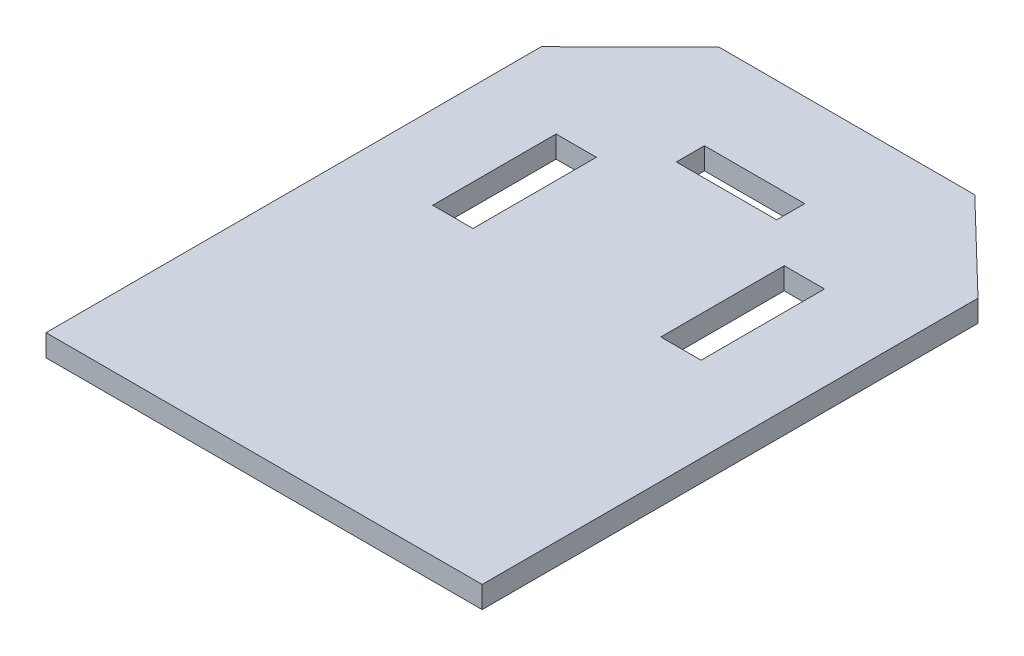
ISO-10303-21;
HEADER;
FILE_DESCRIPTION(('STEP AP214'),'2;1');
FILE_NAME('part.step','',(''),(''),'','','');
FILE_SCHEMA(('AUTOMOTIVE_DESIGN { 1 0 10303 214 1 1 1 1 }'));
ENDSEC;
DATA;
#1=APPLICATION_CONTEXT('core data for automotive mechanical design processes');
#2=APPLICATION_PROTOCOL_DEFINITION('international standard','automotive_design',2000,#1);
#3=PRODUCT_CONTEXT('',#1,'mechanical');
#4=PRODUCT('Part','Part','',(#3));
#5=PRODUCT_RELATED_PRODUCT_CATEGORY('part','',(#4));
#6=PRODUCT_DEFINITION_FORMATION('','',#4);
#7=PRODUCT_DEFINITION_CONTEXT('part definition',#1,'design');
#8=PRODUCT_DEFINITION('design','',#6,#7);
#9=PRODUCT_DEFINITION_SHAPE('','',#8);
#10=(LENGTH_UNIT() NAMED_UNIT(*) SI_UNIT(.MILLI.,.METRE.));
#11=(NAMED_UNIT(*) PLANE_ANGLE_UNIT() SI_UNIT($,.RADIAN.));
#12=(NAMED_UNIT(*) SI_UNIT($,.STERADIAN.) SOLID_ANGLE_UNIT());
#13=UNCERTAINTY_MEASURE_WITH_UNIT(LENGTH_MEASURE(1.E-05),#10,'distance_accuracy_value','');
#14=(GEOMETRIC_REPRESENTATION_CONTEXT(3) GLOBAL_UNCERTAINTY_ASSIGNED_CONTEXT((#13)) GLOBAL_UNIT_ASSIGNED_CONTEXT((#10,
#11,#12)) REPRESENTATION_CONTEXT('',''));
#15=CARTESIAN_POINT('',(0.,0.,0.));
#16=DIRECTION('',(0.,0.,1.));
#17=DIRECTION('',(1.,0.,0.));
#18=AXIS2_PLACEMENT_3D('',#15,#16,#17);
#19=CARTESIAN_POINT('',(0.,5.,-31.2436501547275));
#20=DIRECTION('',(0.,0.,-1.));
#21=DIRECTION('',(-1.,0.,0.));
#22=AXIS2_PLACEMENT_3D('',#19,#20,#21);
#23=PLANE('',#22);
#24=DIRECTION('',(1.,0.,0.));
#25=VECTOR('',#24,1.);
#26=CARTESIAN_POINT('',(0.,0.,-31.2436501547275));
#27=LINE('',#26,#25);
#28=CARTESIAN_POINT('',(-51.1456463230821,0.,-31.2436501547275));
#29=VERTEX_POINT('',#28);
#30=CARTESIAN_POINT('',(-28.1503699672828,0.,-31.2436501547275));
#31=VERTEX_POINT('',#30);
#32=EDGE_CURVE('E240',#29,#31,#27,.T.);
#33=ORIENTED_EDGE('',*,*,#32,.T.);
#34=DIRECTION('',(0.,-1.,0.));
#35=VECTOR('',#34,1.);
#36=CARTESIAN_POINT('',(-28.1503699672828,5.,-31.2436501547275));
#37=LINE('',#36,#35);
#38=CARTESIAN_POINT('',(-28.1503699672828,5.,-31.2436501547275));
#39=VERTEX_POINT('',#38);
#40=EDGE_CURVE('E11',#39,#31,#37,.T.);
#41=ORIENTED_EDGE('',*,*,#40,.F.);
#42=DIRECTION('',(1.,0.,0.));
#43=VECTOR('',#42,1.);
#44=CARTESIAN_POINT('',(0.,5.,-31.2436501547275));
#45=LINE('',#44,#43);
#46=CARTESIAN_POINT('',(-51.1456463230821,5.,-31.2436501547275));
#47=VERTEX_POINT('',#46);
#48=EDGE_CURVE('E180',#47,#39,#45,.T.);
#49=ORIENTED_EDGE('',*,*,#48,.F.);
#50=DIRECTION('',(0.,-1.,0.));
#51=VECTOR('',#50,1.);
#52=CARTESIAN_POINT('',(-51.1456463230821,5.,-31.2436501547275));
#53=LINE('',#52,#51);
#54=EDGE_CURVE('E54',#47,#29,#53,.T.);
#55=ORIENTED_EDGE('',*,*,#54,.T.);
#56=EDGE_LOOP('',(#33,#41,#49,#55));
#57=FACE_BOUND('',#56,.T.);
#58=ADVANCED_FACE('F35',(#57),#23,.F.);
#59=CARTESIAN_POINT('',(-28.1503699672828,5.,0.));
#60=DIRECTION('',(1.,0.,0.));
#61=DIRECTION('',(0.,0.,-1.));
#62=AXIS2_PLACEMENT_3D('',#59,#60,#61);
#63=PLANE('',#62);
#64=DIRECTION('',(0.,0.,1.));
#65=VECTOR('',#64,1.);
#66=CARTESIAN_POINT('',(-28.1503699672828,0.,0.));
#67=LINE('',#66,#65);
#68=CARTESIAN_POINT('',(-28.1503699672828,0.,-24.7964664597565));
#69=VERTEX_POINT('',#68);
#70=EDGE_CURVE('E186',#31,#69,#67,.T.);
#71=ORIENTED_EDGE('',*,*,#70,.T.);
#72=DIRECTION('',(0.,-1.,0.));
#73=VECTOR('',#72,1.);
#74=CARTESIAN_POINT('',(-28.1503699672828,5.,-24.7964664597565));
#75=LINE('',#74,#73);
#76=CARTESIAN_POINT('',(-28.1503699672828,5.,-24.7964664597565));
#77=VERTEX_POINT('',#76);
#78=EDGE_CURVE('E45',#77,#69,#75,.T.);
#79=ORIENTED_EDGE('',*,*,#78,.F.);
#80=DIRECTION('',(0.,0.,1.));
#81=VECTOR('',#80,1.);
#82=CARTESIAN_POINT('',(-28.1503699672828,5.,0.));
#83=LINE('',#82,#81);
#84=EDGE_CURVE('E174',#39,#77,#83,.T.);
#85=ORIENTED_EDGE('',*,*,#84,.F.);
#86=ORIENTED_EDGE('',*,*,#40,.T.);
#87=EDGE_LOOP('',(#71,#79,#85,#86));
#88=FACE_BOUND('',#87,.T.);
#89=ADVANCED_FACE('F185',(#88),#63,.F.);
#90=CARTESIAN_POINT('',(0.,5.,-24.7964664597565));
#91=DIRECTION('',(0.,0.,-1.));
#92=DIRECTION('',(-1.,0.,0.));
#93=AXIS2_PLACEMENT_3D('',#90,#91,#92);
#94=PLANE('',#93);
#95=DIRECTION('',(1.,0.,0.));
#96=VECTOR('',#95,1.);
#97=CARTESIAN_POINT('',(0.,0.,-24.7964664597565));
#98=LINE('',#97,#96);
#99=CARTESIAN_POINT('',(-51.1456463230821,0.,-24.7964664597565));
#100=VERTEX_POINT('',#99);
#101=EDGE_CURVE('E243',#100,#69,#98,.T.);
#102=ORIENTED_EDGE('',*,*,#101,.F.);
#103=DIRECTION('',(0.,-1.,0.));
#104=VECTOR('',#103,1.);
#105=CARTESIAN_POINT('',(-51.1456463230821,5.,-24.7964664597565));
#106=LINE('',#105,#104);
#107=CARTESIAN_POINT('',(-51.1456463230821,5.,-24.7964664597565));
#108=VERTEX_POINT('',#107);
#109=EDGE_CURVE('E113',#108,#100,#106,.T.);
#110=ORIENTED_EDGE('',*,*,#109,.F.);
#111=DIRECTION('',(1.,0.,0.));
#112=VECTOR('',#111,1.);
#113=CARTESIAN_POINT('',(0.,5.,-24.7964664597565));
#114=LINE('',#113,#112);
#115=EDGE_CURVE('E179',#108,#77,#114,.T.);
#116=ORIENTED_EDGE('',*,*,#115,.T.);
#117=ORIENTED_EDGE('',*,*,#78,.T.);
#118=EDGE_LOOP('',(#102,#110,#116,#117));
#119=FACE_BOUND('',#118,.T.);
#120=ADVANCED_FACE('F190',(#119),#94,.T.);
#121=CARTESIAN_POINT('',(-18.1732449895648,5.,0.));
#122=DIRECTION('',(1.,0.,0.));
#123=DIRECTION('',(0.,0.,-1.));
#124=AXIS2_PLACEMENT_3D('',#121,#122,#123);
#125=PLANE('',#124);
#126=DIRECTION('',(0.,0.,1.));
#127=VECTOR('',#126,1.);
#128=CARTESIAN_POINT('',(-18.1732449895648,0.,0.));
#129=LINE('',#128,#127);
#130=CARTESIAN_POINT('',(-18.1732449895648,0.,-16.561444329491));
#131=VERTEX_POINT('',#130);
#132=CARTESIAN_POINT('',(-18.1732449895648,0.,11.738555670509));
#133=VERTEX_POINT('',#132);
#134=EDGE_CURVE('E228',#131,#133,#129,.T.);
#135=ORIENTED_EDGE('',*,*,#134,.F.);
#136=DIRECTION('',(0.,-1.,0.));
#137=VECTOR('',#136,1.);
#138=CARTESIAN_POINT('',(-18.1732449895648,5.,-16.561444329491));
#139=LINE('',#138,#137);
#140=CARTESIAN_POINT('',(-18.1732449895648,5.,-16.561444329491));
#141=VERTEX_POINT('',#140);
#142=EDGE_CURVE('E250',#141,#131,#139,.T.);
#143=ORIENTED_EDGE('',*,*,#142,.F.);
#144=DIRECTION('',(0.,0.,1.));
#145=VECTOR('',#144,1.);
#146=CARTESIAN_POINT('',(-18.1732449895648,5.,0.));
#147=LINE('',#146,#145);
#148=CARTESIAN_POINT('',(-18.1732449895648,5.,11.738555670509));
#149=VERTEX_POINT('',#148);
#150=EDGE_CURVE('E558',#141,#149,#147,.T.);
#151=ORIENTED_EDGE('',*,*,#150,.T.);
#152=DIRECTION('',(0.,-1.,0.));
#153=VECTOR('',#152,1.);
#154=CARTESIAN_POINT('',(-18.1732449895648,5.,11.738555670509));
#155=LINE('',#154,#153);
#156=EDGE_CURVE('E252',#149,#133,#155,.T.);
#157=ORIENTED_EDGE('',*,*,#156,.T.);
#158=EDGE_LOOP('',(#135,#143,#151,#157));
#159=FACE_BOUND('',#158,.T.);
#160=ADVANCED_FACE('F344',(#159),#125,.T.);
#161=CARTESIAN_POINT('',(0.,5.,-16.561444329491));
#162=DIRECTION('',(0.,0.,1.));
#163=DIRECTION('',(1.,0.,0.));
#164=AXIS2_PLACEMENT_3D('',#161,#162,#163);
#165=PLANE('',#164);
#166=DIRECTION('',(-1.,0.,0.));
#167=VECTOR('',#166,1.);
#168=CARTESIAN_POINT('',(0.,0.,-16.561444329491));
#169=LINE('',#168,#167);
#170=CARTESIAN_POINT('',(-8.93513903983412,0.,-16.561444329491));
#171=VERTEX_POINT('',#170);
#172=EDGE_CURVE('E231',#171,#131,#169,.T.);
#173=ORIENTED_EDGE('',*,*,#172,.F.);
#174=DIRECTION('',(0.,-1.,0.));
#175=VECTOR('',#174,1.);
#176=CARTESIAN_POINT('',(-8.93513903983412,5.,-16.561444329491));
#177=LINE('',#176,#175);
#178=CARTESIAN_POINT('',(-8.93513903983412,5.,-16.561444329491));
#179=VERTEX_POINT('',#178);
#180=EDGE_CURVE('E258',#179,#171,#177,.T.);
#181=ORIENTED_EDGE('',*,*,#180,.F.);
#182=DIRECTION('',(-1.,0.,0.));
#183=VECTOR('',#182,1.);
#184=CARTESIAN_POINT('',(0.,5.,-16.561444329491));
#185=LINE('',#184,#183);
#186=EDGE_CURVE('E561',#179,#141,#185,.T.);
#187=ORIENTED_EDGE('',*,*,#186,.T.);
#188=ORIENTED_EDGE('',*,*,#142,.T.);
#189=EDGE_LOOP('',(#173,#181,#187,#188));
#190=FACE_BOUND('',#189,.T.);
#191=ADVANCED_FACE('F340',(#190),#165,.T.);
#192=CARTESIAN_POINT('',(-8.93513903983412,5.,0.));
#193=DIRECTION('',(1.,0.,0.));
#194=DIRECTION('',(0.,0.,-1.));
#195=AXIS2_PLACEMENT_3D('',#192,#193,#194);
#196=PLANE('',#195);
#197=DIRECTION('',(0.,0.,1.));
#198=VECTOR('',#197,1.);
#199=CARTESIAN_POINT('',(-8.93513903983412,0.,0.));
#200=LINE('',#199,#198);
#201=CARTESIAN_POINT('',(-8.93513903983412,0.,11.738555670509));
#202=VERTEX_POINT('',#201);
#203=EDGE_CURVE('E234',#171,#202,#200,.T.);
#204=ORIENTED_EDGE('',*,*,#203,.T.);
#205=DIRECTION('',(0.,-1.,0.));
#206=VECTOR('',#205,1.);
#207=CARTESIAN_POINT('',(-8.93513903983412,5.,11.738555670509));
#208=LINE('',#207,#206);
#209=CARTESIAN_POINT('',(-8.93513903983412,5.,11.738555670509));
#210=VERTEX_POINT('',#209);
#211=EDGE_CURVE('E254',#210,#202,#208,.T.);
#212=ORIENTED_EDGE('',*,*,#211,.F.);
#213=DIRECTION('',(0.,0.,1.));
#214=VECTOR('',#213,1.);
#215=CARTESIAN_POINT('',(-8.93513903983412,5.,0.));
#216=LINE('',#215,#214);
#217=EDGE_CURVE('E569',#179,#210,#216,.T.);
#218=ORIENTED_EDGE('',*,*,#217,.F.);
#219=ORIENTED_EDGE('',*,*,#180,.T.);
#220=EDGE_LOOP('',(#204,#212,#218,#219));
#221=FACE_BOUND('',#220,.T.);
#222=ADVANCED_FACE('F336',(#221),#196,.F.);
#223=CARTESIAN_POINT('',(-70.4830764759141,5.,0.));
#224=DIRECTION('',(1.,0.,0.));
#225=DIRECTION('',(0.,0.,-1.));
#226=AXIS2_PLACEMENT_3D('',#223,#224,#225);
#227=PLANE('',#226);
#228=DIRECTION('',(0.,0.,1.));
#229=VECTOR('',#228,1.);
#230=CARTESIAN_POINT('',(-70.4830764759141,0.,0.));
#231=LINE('',#230,#229);
#232=CARTESIAN_POINT('',(-70.4830764759141,0.,-16.561444329491));
#233=VERTEX_POINT('',#232);
#234=CARTESIAN_POINT('',(-70.4830764759141,0.,11.7385556705091));
#235=VERTEX_POINT('',#234);
#236=EDGE_CURVE('E216',#233,#235,#231,.T.);
#237=ORIENTED_EDGE('',*,*,#236,.F.);
#238=DIRECTION('',(0.,-1.,0.));
#239=VECTOR('',#238,1.);
#240=CARTESIAN_POINT('',(-70.4830764759141,5.,-16.561444329491));
#241=LINE('',#240,#239);
#242=CARTESIAN_POINT('',(-70.4830764759141,5.,-16.561444329491));
#243=VERTEX_POINT('',#242);
#244=EDGE_CURVE('E255',#243,#233,#241,.T.);
#245=ORIENTED_EDGE('',*,*,#244,.F.);
#246=DIRECTION('',(0.,0.,1.));
#247=VECTOR('',#246,1.);
#248=CARTESIAN_POINT('',(-70.4830764759141,5.,0.));
#249=LINE('',#248,#247);
#250=CARTESIAN_POINT('',(-70.4830764759141,5.,11.7385556705091));
#251=VERTEX_POINT('',#250);
#252=EDGE_CURVE('E554',#243,#251,#249,.T.);
#253=ORIENTED_EDGE('',*,*,#252,.T.);
#254=DIRECTION('',(0.,-1.,0.));
#255=VECTOR('',#254,1.);
#256=CARTESIAN_POINT('',(-70.4830764759141,5.,11.7385556705091));
#257=LINE('',#256,#255);
#258=EDGE_CURVE('E261',#251,#235,#257,.T.);
#259=ORIENTED_EDGE('',*,*,#258,.T.);
#260=EDGE_LOOP('',(#237,#245,#253,#259));
#261=FACE_BOUND('',#260,.T.);
#262=ADVANCED_FACE('F339',(#261),#227,.T.);
#263=CARTESIAN_POINT('',(0.,5.,-16.561444329491));
#264=DIRECTION('',(0.,0.,-1.));
#265=DIRECTION('',(-1.,0.,0.));
#266=AXIS2_PLACEMENT_3D('',#263,#264,#265);
#267=PLANE('',#266);
#268=DIRECTION('',(1.,0.,0.));
#269=VECTOR('',#268,1.);
#270=CARTESIAN_POINT('',(0.,0.,-16.561444329491));
#271=LINE('',#270,#269);
#272=CARTESIAN_POINT('',(-61.2449705261834,0.,-16.561444329491));
#273=VERTEX_POINT('',#272);
#274=EDGE_CURVE('E219',#233,#273,#271,.T.);
#275=ORIENTED_EDGE('',*,*,#274,.T.);
#276=DIRECTION('',(0.,-1.,0.));
#277=VECTOR('',#276,1.);
#278=CARTESIAN_POINT('',(-61.2449705261834,5.,-16.561444329491));
#279=LINE('',#278,#277);
#280=CARTESIAN_POINT('',(-61.2449705261834,5.,-16.561444329491));
#281=VERTEX_POINT('',#280);
#282=EDGE_CURVE('E265',#281,#273,#279,.T.);
#283=ORIENTED_EDGE('',*,*,#282,.F.);
#284=DIRECTION('',(1.,0.,0.));
#285=VECTOR('',#284,1.);
#286=CARTESIAN_POINT('',(0.,5.,-16.561444329491));
#287=LINE('',#286,#285);
#288=EDGE_CURVE('E578',#243,#281,#287,.T.);
#289=ORIENTED_EDGE('',*,*,#288,.F.);
#290=ORIENTED_EDGE('',*,*,#244,.T.);
#291=EDGE_LOOP('',(#275,#283,#289,#290));
#292=FACE_BOUND('',#291,.T.);
#293=ADVANCED_FACE('F355',(#292),#267,.F.);
#294=CARTESIAN_POINT('',(-61.2449705261834,5.,0.));
#295=DIRECTION('',(1.,0.,0.));
#296=DIRECTION('',(0.,0.,-1.));
#297=AXIS2_PLACEMENT_3D('',#294,#295,#296);
#298=PLANE('',#297);
#299=DIRECTION('',(0.,0.,1.));
#300=VECTOR('',#299,1.);
#301=CARTESIAN_POINT('',(-61.2449705261834,0.,0.));
#302=LINE('',#301,#300);
#303=CARTESIAN_POINT('',(-61.2449705261834,0.,11.738555670509));
#304=VERTEX_POINT('',#303);
#305=EDGE_CURVE('E222',#273,#304,#302,.T.);
#306=ORIENTED_EDGE('',*,*,#305,.T.);
#307=DIRECTION('',(0.,-1.,0.));
#308=VECTOR('',#307,1.);
#309=CARTESIAN_POINT('',(-61.2449705261834,5.,11.738555670509));
#310=LINE('',#309,#308);
#311=CARTESIAN_POINT('',(-61.2449705261834,5.,11.738555670509));
#312=VERTEX_POINT('',#311);
#313=EDGE_CURVE('E263',#312,#304,#310,.T.);
#314=ORIENTED_EDGE('',*,*,#313,.F.);
#315=DIRECTION('',(0.,0.,1.));
#316=VECTOR('',#315,1.);
#317=CARTESIAN_POINT('',(-61.2449705261834,5.,0.));
#318=LINE('',#317,#316);
#319=EDGE_CURVE('E576',#281,#312,#318,.T.);
#320=ORIENTED_EDGE('',*,*,#319,.F.);
#321=ORIENTED_EDGE('',*,*,#282,.T.);
#322=EDGE_LOOP('',(#306,#314,#320,#321));
#323=FACE_BOUND('',#322,.T.);
#324=ADVANCED_FACE('F352',(#323),#298,.F.);
#325=CARTESIAN_POINT('',(10.4878077419577,5.,0.));
#326=DIRECTION('',(1.,0.,0.));
#327=DIRECTION('',(0.,0.,-1.));
#328=AXIS2_PLACEMENT_3D('',#325,#326,#327);
#329=PLANE('',#328);
#330=DIRECTION('',(0.,0.,1.));
#331=VECTOR('',#330,1.);
#332=CARTESIAN_POINT('',(10.4878077419577,0.,0.));
#333=LINE('',#332,#331);
#334=CARTESIAN_POINT('',(10.4878077419577,0.,-32.3328844355627));
#335=VERTEX_POINT('',#334);
#336=CARTESIAN_POINT('',(10.4878077419578,0.,81.3655405157913));
#337=VERTEX_POINT('',#336);
#338=EDGE_CURVE('E197',#335,#337,#333,.T.);
#339=ORIENTED_EDGE('',*,*,#338,.F.);
#340=DIRECTION('',(0.,-1.,0.));
#341=VECTOR('',#340,1.);
#342=CARTESIAN_POINT('',(10.4878077419577,5.,-32.3328844355627));
#343=LINE('',#342,#341);
#344=CARTESIAN_POINT('',(10.4878077419577,5.,-32.3328844355627));
#345=VERTEX_POINT('',#344);
#346=EDGE_CURVE('E39',#345,#335,#343,.T.);
#347=ORIENTED_EDGE('',*,*,#346,.F.);
#348=DIRECTION('',(0.,0.,1.));
#349=VECTOR('',#348,1.);
#350=CARTESIAN_POINT('',(10.4878077419577,5.,0.));
#351=LINE('',#350,#349);
#352=CARTESIAN_POINT('',(10.4878077419578,5.,81.3655405157913));
#353=VERTEX_POINT('',#352);
#354=EDGE_CURVE('E248',#345,#353,#351,.T.);
#355=ORIENTED_EDGE('',*,*,#354,.T.);
#356=DIRECTION('',(0.,-1.,0.));
#357=VECTOR('',#356,1.);
#358=CARTESIAN_POINT('',(10.4878077419578,5.,81.3655405157913));
#359=LINE('',#358,#357);
#360=EDGE_CURVE('E193',#353,#337,#359,.T.);
#361=ORIENTED_EDGE('',*,*,#360,.T.);
#362=EDGE_LOOP('',(#339,#347,#355,#361));
#363=FACE_BOUND('',#362,.T.);
#364=ADVANCED_FACE('F37',(#363),#329,.T.);
#365=CARTESIAN_POINT('',(21.2109636780761,5.,-21.9892751112715));
#366=DIRECTION('',(-0.694254619899932,0.,0.71972947886522));
#367=DIRECTION('',(0.71972947886522,0.,0.694254619899932));
#368=AXIS2_PLACEMENT_3D('',#365,#366,#367);
#369=PLANE('',#368);
#370=DIRECTION('',(-0.71972947886522,0.,-0.694254619899932));
#371=VECTOR('',#370,1.);
#372=CARTESIAN_POINT('',(21.2109636780761,0.,-21.9892751112715));
#373=LINE('',#372,#371);
#374=CARTESIAN_POINT('',(-10.4089539136275,0.,-52.4900042234193));
#375=VERTEX_POINT('',#374);
#376=EDGE_CURVE('E200',#335,#375,#373,.T.);
#377=ORIENTED_EDGE('',*,*,#376,.T.);
#378=DIRECTION('',(0.,-1.,0.));
#379=VECTOR('',#378,1.);
#380=CARTESIAN_POINT('',(-10.4089539136275,5.,-52.4900042234193));
#381=LINE('',#380,#379);
#382=CARTESIAN_POINT('',(-10.4089539136275,5.,-52.4900042234193));
#383=VERTEX_POINT('',#382);
#384=EDGE_CURVE('E278',#383,#375,#381,.T.);
#385=ORIENTED_EDGE('',*,*,#384,.F.);
#386=DIRECTION('',(-0.71972947886522,0.,-0.694254619899932));
#387=VECTOR('',#386,1.);
#388=CARTESIAN_POINT('',(21.2109636780761,5.,-21.9892751112715));
#389=LINE('',#388,#387);
#390=EDGE_CURVE('E287',#345,#383,#389,.T.);
#391=ORIENTED_EDGE('',*,*,#390,.F.);
#392=ORIENTED_EDGE('',*,*,#346,.T.);
#393=EDGE_LOOP('',(#377,#385,#391,#392));
#394=FACE_BOUND('',#393,.T.);
#395=ADVANCED_FACE('F286',(#394),#369,.F.);
#396=CARTESIAN_POINT('',(0.,5.,-52.4900042234193));
#397=DIRECTION('',(0.,0.,1.));
#398=DIRECTION('',(1.,0.,0.));
#399=AXIS2_PLACEMENT_3D('',#396,#397,#398);
#400=PLANE('',#399);
#401=DIRECTION('',(-1.,0.,0.));
#402=VECTOR('',#401,1.);
#403=CARTESIAN_POINT('',(0.,0.,-52.4900042234193));
#404=LINE('',#403,#402);
#405=CARTESIAN_POINT('',(-69.0092616021207,0.,-52.4900042234193));
#406=VERTEX_POINT('',#405);
#407=EDGE_CURVE('E202',#375,#406,#404,.T.);
#408=ORIENTED_EDGE('',*,*,#407,.T.);
#409=DIRECTION('',(0.,-1.,0.));
#410=VECTOR('',#409,1.);
#411=CARTESIAN_POINT('',(-69.0092616021207,5.,-52.4900042234193));
#412=LINE('',#411,#410);
#413=CARTESIAN_POINT('',(-69.0092616021207,5.,-52.4900042234193));
#414=VERTEX_POINT('',#413);
#415=EDGE_CURVE('E277',#414,#406,#412,.T.);
#416=ORIENTED_EDGE('',*,*,#415,.F.);
#417=DIRECTION('',(-1.,0.,0.));
#418=VECTOR('',#417,1.);
#419=CARTESIAN_POINT('',(0.,5.,-52.4900042234193));
#420=LINE('',#419,#418);
#421=EDGE_CURVE('E587',#383,#414,#420,.T.);
#422=ORIENTED_EDGE('',*,*,#421,.F.);
#423=ORIENTED_EDGE('',*,*,#384,.T.);
#424=EDGE_LOOP('',(#408,#416,#422,#423));
#425=FACE_BOUND('',#424,.T.);
#426=ADVANCED_FACE('F314',(#425),#400,.F.);
#427=CARTESIAN_POINT('',(-60.7496329127701,5.,-60.7496329127699));
#428=DIRECTION('',(-0.707106781186548,0.,-0.707106781186547));
#429=DIRECTION('',(-0.707106781186547,0.,0.707106781186548));
#430=AXIS2_PLACEMENT_3D('',#427,#428,#429);
#431=PLANE('',#430);
#432=DIRECTION('',(0.707106781186547,0.,-0.707106781186548));
#433=VECTOR('',#432,1.);
#434=CARTESIAN_POINT('',(-60.7496329127701,0.,-60.7496329127699));
#435=LINE('',#434,#433);
#436=CARTESIAN_POINT('',(-84.643850890051,0.,-36.8554149354889));
#437=VERTEX_POINT('',#436);
#438=EDGE_CURVE('E205',#437,#406,#435,.T.);
#439=ORIENTED_EDGE('',*,*,#438,.F.);
#440=DIRECTION('',(0.,-1.,0.));
#441=VECTOR('',#440,1.);
#442=CARTESIAN_POINT('',(-84.643850890051,5.,-36.8554149354889));
#443=LINE('',#442,#441);
#444=CARTESIAN_POINT('',(-84.643850890051,5.,-36.8554149354889));
#445=VERTEX_POINT('',#444);
#446=EDGE_CURVE('E275',#445,#437,#443,.T.);
#447=ORIENTED_EDGE('',*,*,#446,.F.);
#448=DIRECTION('',(0.707106781186547,0.,-0.707106781186548));
#449=VECTOR('',#448,1.);
#450=CARTESIAN_POINT('',(-60.7496329127701,5.,-60.7496329127699));
#451=LINE('',#450,#449);
#452=EDGE_CURVE('E313',#445,#414,#451,.T.);
#453=ORIENTED_EDGE('',*,*,#452,.T.);
#454=ORIENTED_EDGE('',*,*,#415,.T.);
#455=EDGE_LOOP('',(#439,#447,#453,#454));
#456=FACE_BOUND('',#455,.T.);
#457=ADVANCED_FACE('F311',(#456),#431,.T.);
#458=CARTESIAN_POINT('',(-57.5870070795417,5.,-61.9903412102378));
#459=DIRECTION('',(-0.68060687423197,0.,-0.732648812698272));
#460=DIRECTION('',(-0.732648812698272,0.,0.68060687423197));
#461=AXIS2_PLACEMENT_3D('',#458,#459,#460);
#462=PLANE('',#461);
#463=DIRECTION('',(0.732648812698272,0.,-0.68060687423197));
#464=VECTOR('',#463,1.);
#465=CARTESIAN_POINT('',(-57.5870070795417,0.,-61.9903412102378));
#466=LINE('',#465,#464);
#467=CARTESIAN_POINT('',(-89.5121922580422,0.,-32.3328844355626));
#468=VERTEX_POINT('',#467);
#469=EDGE_CURVE('E208',#468,#437,#466,.T.);
#470=ORIENTED_EDGE('',*,*,#469,.F.);
#471=DIRECTION('',(0.,-1.,0.));
#472=VECTOR('',#471,1.);
#473=CARTESIAN_POINT('',(-89.5121922580422,5.,-32.3328844355626));
#474=LINE('',#473,#472);
#475=CARTESIAN_POINT('',(-89.5121922580422,5.,-32.3328844355626));
#476=VERTEX_POINT('',#475);
#477=EDGE_CURVE('E273',#476,#468,#474,.T.);
#478=ORIENTED_EDGE('',*,*,#477,.F.);
#479=DIRECTION('',(0.732648812698272,0.,-0.68060687423197));
#480=VECTOR('',#479,1.);
#481=CARTESIAN_POINT('',(-57.5870070795417,5.,-61.9903412102378));
#482=LINE('',#481,#480);
#483=EDGE_CURVE('E307',#476,#445,#482,.T.);
#484=ORIENTED_EDGE('',*,*,#483,.T.);
#485=ORIENTED_EDGE('',*,*,#446,.T.);
#486=EDGE_LOOP('',(#470,#478,#484,#485));
#487=FACE_BOUND('',#486,.T.);
#488=ADVANCED_FACE('F302',(#487),#462,.T.);
#489=CARTESIAN_POINT('',(-89.5121922580422,5.,0.));
#490=DIRECTION('',(1.,0.,0.));
#491=DIRECTION('',(0.,0.,-1.));
#492=AXIS2_PLACEMENT_3D('',#489,#490,#491);
#493=PLANE('',#492);
#494=DIRECTION('',(0.,0.,1.));
#495=VECTOR('',#494,1.);
#496=CARTESIAN_POINT('',(-89.5121922580422,0.,0.));
#497=LINE('',#496,#495);
#498=CARTESIAN_POINT('',(-89.5121922580422,0.,81.3655405157913));
#499=VERTEX_POINT('',#498);
#500=EDGE_CURVE('E211',#468,#499,#497,.T.);
#501=ORIENTED_EDGE('',*,*,#500,.T.);
#502=DIRECTION('',(0.,-1.,0.));
#503=VECTOR('',#502,1.);
#504=CARTESIAN_POINT('',(-89.5121922580422,5.,81.3655405157913));
#505=LINE('',#504,#503);
#506=CARTESIAN_POINT('',(-89.5121922580422,5.,81.3655405157913));
#507=VERTEX_POINT('',#506);
#508=EDGE_CURVE('E270',#507,#499,#505,.T.);
#509=ORIENTED_EDGE('',*,*,#508,.F.);
#510=DIRECTION('',(0.,0.,1.));
#511=VECTOR('',#510,1.);
#512=CARTESIAN_POINT('',(-89.5121922580422,5.,0.));
#513=LINE('',#512,#511);
#514=EDGE_CURVE('E583',#476,#507,#513,.T.);
#515=ORIENTED_EDGE('',*,*,#514,.F.);
#516=ORIENTED_EDGE('',*,*,#477,.T.);
#517=EDGE_LOOP('',(#501,#509,#515,#516));
#518=FACE_BOUND('',#517,.T.);
#519=ADVANCED_FACE('F334',(#518),#493,.F.);
#520=CARTESIAN_POINT('',(0.,5.,11.738555670509));
#521=DIRECTION('',(0.,0.,1.));
#522=DIRECTION('',(1.,0.,0.));
#523=AXIS2_PLACEMENT_3D('',#520,#521,#522);
#524=PLANE('',#523);
#525=DIRECTION('',(-1.,0.,0.));
#526=VECTOR('',#525,1.);
#527=CARTESIAN_POINT('',(0.,0.,11.738555670509));
#528=LINE('',#527,#526);
#529=EDGE_CURVE('E237',#202,#133,#528,.T.);
#530=ORIENTED_EDGE('',*,*,#529,.T.);
#531=ORIENTED_EDGE('',*,*,#156,.F.);
#532=DIRECTION('',(-1.,0.,0.));
#533=VECTOR('',#532,1.);
#534=CARTESIAN_POINT('',(0.,5.,11.738555670509));
#535=LINE('',#534,#533);
#536=EDGE_CURVE('E562',#210,#149,#535,.T.);
#537=ORIENTED_EDGE('',*,*,#536,.F.);
#538=ORIENTED_EDGE('',*,*,#211,.T.);
#539=EDGE_LOOP('',(#530,#531,#537,#538));
#540=FACE_BOUND('',#539,.T.);
#541=ADVANCED_FACE('F330',(#540),#524,.F.);
#542=CARTESIAN_POINT('',(0.,5.,11.7385556705088));
#543=DIRECTION('',(0.,0.,-1.));
#544=DIRECTION('',(-1.,0.,0.));
#545=AXIS2_PLACEMENT_3D('',#542,#543,#544);
#546=PLANE('',#545);
#547=DIRECTION('',(1.,0.,0.));
#548=VECTOR('',#547,1.);
#549=CARTESIAN_POINT('',(0.,0.,11.7385556705088));
#550=LINE('',#549,#548);
#551=EDGE_CURVE('E225',#235,#304,#550,.T.);
#552=ORIENTED_EDGE('',*,*,#551,.F.);
#553=ORIENTED_EDGE('',*,*,#258,.F.);
#554=DIRECTION('',(1.,0.,0.));
#555=VECTOR('',#554,1.);
#556=CARTESIAN_POINT('',(0.,5.,11.7385556705088));
#557=LINE('',#556,#555);
#558=EDGE_CURVE('E564',#251,#312,#557,.T.);
#559=ORIENTED_EDGE('',*,*,#558,.T.);
#560=ORIENTED_EDGE('',*,*,#313,.T.);
#561=EDGE_LOOP('',(#552,#553,#559,#560));
#562=FACE_BOUND('',#561,.T.);
#563=ADVANCED_FACE('F333',(#562),#546,.T.);
#564=CARTESIAN_POINT('',(0.,5.,81.3655405157913));
#565=DIRECTION('',(0.,0.,-1.));
#566=DIRECTION('',(-1.,0.,0.));
#567=AXIS2_PLACEMENT_3D('',#564,#565,#566);
#568=PLANE('',#567);
#569=DIRECTION('',(1.,0.,0.));
#570=VECTOR('',#569,1.);
#571=CARTESIAN_POINT('',(0.,0.,81.3655405157913));
#572=LINE('',#571,#570);
#573=EDGE_CURVE('E213',#499,#337,#572,.T.);
#574=ORIENTED_EDGE('',*,*,#573,.T.);
#575=ORIENTED_EDGE('',*,*,#360,.F.);
#576=DIRECTION('',(1.,0.,0.));
#577=VECTOR('',#576,1.);
#578=CARTESIAN_POINT('',(0.,5.,81.3655405157913));
#579=LINE('',#578,#577);
#580=EDGE_CURVE('E581',#507,#353,#579,.T.);
#581=ORIENTED_EDGE('',*,*,#580,.F.);
#582=ORIENTED_EDGE('',*,*,#508,.T.);
#583=EDGE_LOOP('',(#574,#575,#581,#582));
#584=FACE_BOUND('',#583,.T.);
#585=ADVANCED_FACE('F296',(#584),#568,.F.);
#586=CARTESIAN_POINT('',(-51.1456463230821,5.,0.));
#587=DIRECTION('',(1.,0.,0.));
#588=DIRECTION('',(0.,0.,-1.));
#589=AXIS2_PLACEMENT_3D('',#586,#587,#588);
#590=PLANE('',#589);
#591=DIRECTION('',(0.,0.,1.));
#592=VECTOR('',#591,1.);
#593=CARTESIAN_POINT('',(-51.1456463230821,0.,0.));
#594=LINE('',#593,#592);
#595=EDGE_CURVE('E245',#29,#100,#594,.T.);
#596=ORIENTED_EDGE('',*,*,#595,.F.);
#597=ORIENTED_EDGE('',*,*,#54,.F.);
#598=DIRECTION('',(0.,0.,1.));
#599=VECTOR('',#598,1.);
#600=CARTESIAN_POINT('',(-51.1456463230821,5.,0.));
#601=LINE('',#600,#599);
#602=EDGE_CURVE('E191',#47,#108,#601,.T.);
#603=ORIENTED_EDGE('',*,*,#602,.T.);
#604=ORIENTED_EDGE('',*,*,#109,.T.);
#605=EDGE_LOOP('',(#596,#597,#603,#604));
#606=FACE_BOUND('',#605,.T.);
#607=ADVANCED_FACE('F365',(#606),#590,.T.);
#608=CARTESIAN_POINT('',(0.,5.,0.));
#609=DIRECTION('',(0.,1.,0.));
#610=DIRECTION('',(0.,0.,1.));
#611=AXIS2_PLACEMENT_3D('',#608,#609,#610);
#612=PLANE('',#611);
#613=ORIENTED_EDGE('',*,*,#354,.F.);
#614=ORIENTED_EDGE('',*,*,#390,.T.);
#615=ORIENTED_EDGE('',*,*,#421,.T.);
#616=ORIENTED_EDGE('',*,*,#452,.F.);
#617=ORIENTED_EDGE('',*,*,#483,.F.);
#618=ORIENTED_EDGE('',*,*,#514,.T.);
#619=ORIENTED_EDGE('',*,*,#580,.T.);
#620=EDGE_LOOP('',(#613,#614,#615,#616,#617,#618,#619));
#621=FACE_BOUND('',#620,.T.);
#622=ORIENTED_EDGE('',*,*,#252,.F.);
#623=ORIENTED_EDGE('',*,*,#288,.T.);
#624=ORIENTED_EDGE('',*,*,#319,.T.);
#625=ORIENTED_EDGE('',*,*,#558,.F.);
#626=EDGE_LOOP('',(#622,#623,#624,#625));
#627=FACE_BOUND('',#626,.T.);
#628=ORIENTED_EDGE('',*,*,#150,.F.);
#629=ORIENTED_EDGE('',*,*,#186,.F.);
#630=ORIENTED_EDGE('',*,*,#217,.T.);
#631=ORIENTED_EDGE('',*,*,#536,.T.);
#632=EDGE_LOOP('',(#628,#629,#630,#631));
#633=FACE_BOUND('',#632,.T.);
#634=ORIENTED_EDGE('',*,*,#48,.T.);
#635=ORIENTED_EDGE('',*,*,#84,.T.);
#636=ORIENTED_EDGE('',*,*,#115,.F.);
#637=ORIENTED_EDGE('',*,*,#602,.F.);
#638=EDGE_LOOP('',(#634,#635,#636,#637));
#639=FACE_BOUND('',#638,.T.);
#640=ADVANCED_FACE('F176',(#621,#627,#633,#639),#612,.T.);
#641=CARTESIAN_POINT('',(0.,0.,0.));
#642=DIRECTION('',(0.,1.,0.));
#643=DIRECTION('',(0.,0.,1.));
#644=AXIS2_PLACEMENT_3D('',#641,#642,#643);
#645=PLANE('',#644);
#646=ORIENTED_EDGE('',*,*,#338,.T.);
#647=ORIENTED_EDGE('',*,*,#573,.F.);
#648=ORIENTED_EDGE('',*,*,#500,.F.);
#649=ORIENTED_EDGE('',*,*,#469,.T.);
#650=ORIENTED_EDGE('',*,*,#438,.T.);
#651=ORIENTED_EDGE('',*,*,#407,.F.);
#652=ORIENTED_EDGE('',*,*,#376,.F.);
#653=EDGE_LOOP('',(#646,#647,#648,#649,#650,#651,#652));
#654=FACE_BOUND('',#653,.T.);
#655=ORIENTED_EDGE('',*,*,#236,.T.);
#656=ORIENTED_EDGE('',*,*,#551,.T.);
#657=ORIENTED_EDGE('',*,*,#305,.F.);
#658=ORIENTED_EDGE('',*,*,#274,.F.);
#659=EDGE_LOOP('',(#655,#656,#657,#658));
#660=FACE_BOUND('',#659,.T.);
#661=ORIENTED_EDGE('',*,*,#134,.T.);
#662=ORIENTED_EDGE('',*,*,#529,.F.);
#663=ORIENTED_EDGE('',*,*,#203,.F.);
#664=ORIENTED_EDGE('',*,*,#172,.T.);
#665=EDGE_LOOP('',(#661,#662,#663,#664));
#666=FACE_BOUND('',#665,.T.);
#667=ORIENTED_EDGE('',*,*,#32,.F.);
#668=ORIENTED_EDGE('',*,*,#595,.T.);
#669=ORIENTED_EDGE('',*,*,#101,.T.);
#670=ORIENTED_EDGE('',*,*,#70,.F.);
#671=EDGE_LOOP('',(#667,#668,#669,#670));
#672=FACE_BOUND('',#671,.T.);
#673=ADVANCED_FACE('F290',(#654,#660,#666,#672),#645,.F.);
#674=CLOSED_SHELL('',(#58,#89,#120,#160,#191,#222,#262,#293,#324,#364,#395,#426,#457,#488,#519,
#541,#563,#585,#607,#640,#673));
#675=MANIFOLD_SOLID_BREP('B2',#674);
#676=ADVANCED_BREP_SHAPE_REPRESENTATION('',(#18,#675),#14);
#677=SHAPE_DEFINITION_REPRESENTATION(#9,#676);
ENDSEC;
END-ISO-10303-21;
